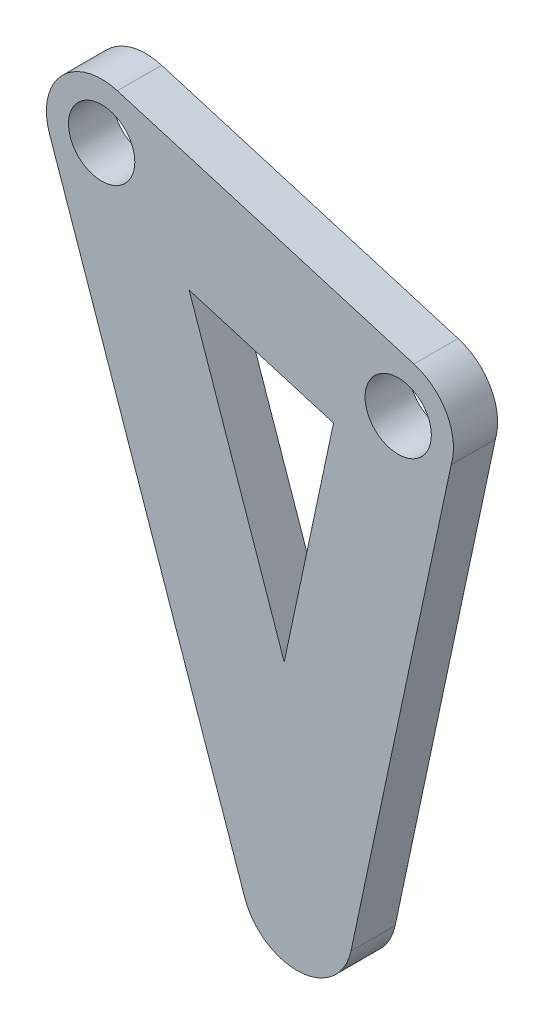
ISO-10303-21;
HEADER;
FILE_DESCRIPTION(('STEP AP214'),'2;1');
FILE_NAME('part.step','',(''),(''),'','','');
FILE_SCHEMA(('AUTOMOTIVE_DESIGN { 1 0 10303 214 1 1 1 1 }'));
ENDSEC;
DATA;
#1=APPLICATION_CONTEXT('core data for automotive mechanical design processes');
#2=APPLICATION_PROTOCOL_DEFINITION('international standard','automotive_design',2000,#1);
#3=PRODUCT_CONTEXT('',#1,'mechanical');
#4=PRODUCT('Part','Part','',(#3));
#5=PRODUCT_RELATED_PRODUCT_CATEGORY('part','',(#4));
#6=PRODUCT_DEFINITION_FORMATION('','',#4);
#7=PRODUCT_DEFINITION_CONTEXT('part definition',#1,'design');
#8=PRODUCT_DEFINITION('design','',#6,#7);
#9=PRODUCT_DEFINITION_SHAPE('','',#8);
#10=(LENGTH_UNIT() NAMED_UNIT(*) SI_UNIT(.MILLI.,.METRE.));
#11=(NAMED_UNIT(*) PLANE_ANGLE_UNIT() SI_UNIT($,.RADIAN.));
#12=(NAMED_UNIT(*) SI_UNIT($,.STERADIAN.) SOLID_ANGLE_UNIT());
#13=UNCERTAINTY_MEASURE_WITH_UNIT(LENGTH_MEASURE(1.E-05),#10,'distance_accuracy_value','');
#14=(GEOMETRIC_REPRESENTATION_CONTEXT(3) GLOBAL_UNCERTAINTY_ASSIGNED_CONTEXT((#13)) GLOBAL_UNIT_ASSIGNED_CONTEXT((#10,
#11,#12)) REPRESENTATION_CONTEXT('',''));
#15=CARTESIAN_POINT('',(0.,0.,0.));
#16=DIRECTION('',(0.,0.,1.));
#17=DIRECTION('',(1.,0.,0.));
#18=AXIS2_PLACEMENT_3D('',#15,#16,#17);
#19=CARTESIAN_POINT('',(-6.27205932046679,-21.0573996219625,-2.));
#20=DIRECTION('',(-0.285461637934703,-0.958390136253309,0.));
#21=DIRECTION('',(0.958390136253309,-0.285461637934703,0.));
#22=AXIS2_PLACEMENT_3D('',#19,#20,#21);
#23=PLANE('',#22);
#24=DIRECTION('',(0.958390136253309,-0.285461637934703,0.));
#25=VECTOR('',#24,1.);
#26=CARTESIAN_POINT('',(-6.27205932046679,-21.0573996219625,0.));
#27=LINE('',#26,#25);
#28=CARTESIAN_POINT('',(-30.620361937396,-13.8051272090489,0.));
#29=VERTEX_POINT('',#28);
#30=CARTESIAN_POINT('',(-24.0859127583845,-15.7514479140323,0.));
#31=VERTEX_POINT('',#30);
#32=EDGE_CURVE('E157',#29,#31,#27,.T.);
#33=ORIENTED_EDGE('',*,*,#32,.F.);
#34=DIRECTION('',(0.,0.,1.));
#35=VECTOR('',#34,1.);
#36=CARTESIAN_POINT('',(-30.620361937396,-13.8051272090489,-2.));
#37=LINE('',#36,#35);
#38=CARTESIAN_POINT('',(-30.620361937396,-13.8051272090489,-2.));
#39=VERTEX_POINT('',#38);
#40=EDGE_CURVE('E11',#39,#29,#37,.T.);
#41=ORIENTED_EDGE('',*,*,#40,.F.);
#42=DIRECTION('',(0.958390136253309,-0.285461637934703,0.));
#43=VECTOR('',#42,1.);
#44=CARTESIAN_POINT('',(-6.27205932046679,-21.0573996219625,-2.));
#45=LINE('',#44,#43);
#46=CARTESIAN_POINT('',(-24.0859127583845,-15.7514479140323,-2.));
#47=VERTEX_POINT('',#46);
#48=EDGE_CURVE('E127',#39,#47,#45,.T.);
#49=ORIENTED_EDGE('',*,*,#48,.T.);
#50=DIRECTION('',(0.,0.,1.));
#51=VECTOR('',#50,1.);
#52=CARTESIAN_POINT('',(-24.0859127583845,-15.7514479140323,-2.));
#53=LINE('',#52,#51);
#54=EDGE_CURVE('E115',#47,#31,#53,.T.);
#55=ORIENTED_EDGE('',*,*,#54,.T.);
#56=EDGE_LOOP('',(#33,#41,#49,#55));
#57=FACE_BOUND('',#56,.T.);
#58=ADVANCED_FACE('F39',(#57),#23,.T.);
#59=CARTESIAN_POINT('',(-31.6105521830669,-10.9454491931307,-2.));
#60=DIRECTION('',(-0.944955252141447,-0.327199589624275,0.));
#61=DIRECTION('',(0.327199589624275,-0.944955252141447,0.));
#62=AXIS2_PLACEMENT_3D('',#59,#60,#61);
#63=PLANE('',#62);
#64=DIRECTION('',(0.327199589624275,-0.944955252141447,0.));
#65=VECTOR('',#64,1.);
#66=CARTESIAN_POINT('',(-31.6105521830669,-10.9454491931307,0.));
#67=LINE('',#66,#65);
#68=CARTESIAN_POINT('',(-26.3179189103769,-26.230619979653,0.));
#69=VERTEX_POINT('',#68);
#70=EDGE_CURVE('E160',#29,#69,#67,.T.);
#71=ORIENTED_EDGE('',*,*,#70,.T.);
#72=DIRECTION('',(0.,0.,1.));
#73=VECTOR('',#72,1.);
#74=CARTESIAN_POINT('',(-26.3179189103769,-26.230619979653,-2.));
#75=LINE('',#74,#73);
#76=CARTESIAN_POINT('',(-26.3179189103769,-26.230619979653,-2.));
#77=VERTEX_POINT('',#76);
#78=EDGE_CURVE('E49',#77,#69,#75,.T.);
#79=ORIENTED_EDGE('',*,*,#78,.F.);
#80=DIRECTION('',(0.327199589624275,-0.944955252141447,0.));
#81=VECTOR('',#80,1.);
#82=CARTESIAN_POINT('',(-31.6105521830669,-10.9454491931307,-2.));
#83=LINE('',#82,#81);
#84=EDGE_CURVE('E128',#39,#77,#83,.T.);
#85=ORIENTED_EDGE('',*,*,#84,.F.);
#86=ORIENTED_EDGE('',*,*,#40,.T.);
#87=EDGE_LOOP('',(#71,#79,#85,#86));
#88=FACE_BOUND('',#87,.T.);
#89=ADVANCED_FACE('F217',(#88),#63,.F.);
#90=CARTESIAN_POINT('',(-14.9563728948536,3.17994453566595,-2.));
#91=DIRECTION('',(0.978136036901298,-0.207966086934921,0.));
#92=DIRECTION('',(0.207966086934921,0.978136036901298,0.));
#93=AXIS2_PLACEMENT_3D('',#90,#91,#92);
#94=PLANE('',#93);
#95=DIRECTION('',(0.207966086934921,0.978136036901298,0.));
#96=VECTOR('',#95,1.);
#97=CARTESIAN_POINT('',(-14.9563728948536,3.17994453566595,0.));
#98=LINE('',#97,#96);
#99=CARTESIAN_POINT('',(-23.2977836940613,-36.052579485695,0.));
#100=VERTEX_POINT('',#99);
#101=CARTESIAN_POINT('',(-18.7638863744568,-14.7281009551973,0.));
#102=VERTEX_POINT('',#101);
#103=EDGE_CURVE('E138',#100,#102,#98,.T.);
#104=ORIENTED_EDGE('',*,*,#103,.F.);
#105=DIRECTION('',(0.,0.,1.));
#106=VECTOR('',#105,1.);
#107=CARTESIAN_POINT('',(-23.2977836940613,-36.052579485695,-2.));
#108=LINE('',#107,#106);
#109=CARTESIAN_POINT('',(-23.2977836940613,-36.052579485695,-2.));
#110=VERTEX_POINT('',#109);
#111=EDGE_CURVE('E122',#110,#100,#108,.T.);
#112=ORIENTED_EDGE('',*,*,#111,.F.);
#113=DIRECTION('',(0.207966086934921,0.978136036901298,0.));
#114=VECTOR('',#113,1.);
#115=CARTESIAN_POINT('',(-14.9563728948536,3.17994453566595,-2.));
#116=LINE('',#115,#114);
#117=CARTESIAN_POINT('',(-18.7638863744568,-14.7281009551973,-2.));
#118=VERTEX_POINT('',#117);
#119=EDGE_CURVE('E161',#110,#118,#116,.T.);
#120=ORIENTED_EDGE('',*,*,#119,.T.);
#121=DIRECTION('',(0.,0.,1.));
#122=VECTOR('',#121,1.);
#123=CARTESIAN_POINT('',(-18.7638863744568,-14.7281009551973,-2.));
#124=LINE('',#123,#122);
#125=EDGE_CURVE('E43',#118,#102,#124,.T.);
#126=ORIENTED_EDGE('',*,*,#125,.T.);
#127=EDGE_LOOP('',(#104,#112,#120,#126));
#128=FACE_BOUND('',#127,.T.);
#129=ADVANCED_FACE('F41',(#128),#94,.T.);
#130=CARTESIAN_POINT('',(-25.742934702781,-35.5317757370937,-2.));
#131=DIRECTION('',(0.,0.,1.));
#132=DIRECTION('',(1.,0.,0.));
#133=AXIS2_PLACEMENT_3D('',#130,#131,#132);
#134=CYLINDRICAL_SURFACE('',#133,2.49999999999999);
#135=CARTESIAN_POINT('',(-25.742934702781,-35.5317757370937,0.));
#136=DIRECTION('',(0.,0.,1.));
#137=DIRECTION('',(1.,0.,0.));
#138=AXIS2_PLACEMENT_3D('',#135,#136,#137);
#139=CIRCLE('',#138,2.49999999999999);
#140=CARTESIAN_POINT('',(-28.1053228331346,-36.3497747111544,0.));
#141=VERTEX_POINT('',#140);
#142=EDGE_CURVE('E154',#141,#100,#139,.T.);
#143=ORIENTED_EDGE('',*,*,#142,.F.);
#144=DIRECTION('',(0.,0.,1.));
#145=VECTOR('',#144,1.);
#146=CARTESIAN_POINT('',(-28.1053228331346,-36.3497747111544,-2.));
#147=LINE('',#146,#145);
#148=CARTESIAN_POINT('',(-28.1053228331346,-36.3497747111544,-2.));
#149=VERTEX_POINT('',#148);
#150=EDGE_CURVE('E165',#149,#141,#147,.T.);
#151=ORIENTED_EDGE('',*,*,#150,.F.);
#152=CARTESIAN_POINT('',(-25.742934702781,-35.5317757370937,-2.));
#153=DIRECTION('',(0.,0.,1.));
#154=DIRECTION('',(1.,0.,0.));
#155=AXIS2_PLACEMENT_3D('',#152,#153,#154);
#156=CIRCLE('',#155,2.49999999999999);
#157=EDGE_CURVE('E130',#149,#110,#156,.T.);
#158=ORIENTED_EDGE('',*,*,#157,.T.);
#159=ORIENTED_EDGE('',*,*,#111,.T.);
#160=EDGE_LOOP('',(#143,#151,#158,#159));
#161=FACE_BOUND('',#160,.T.);
#162=ADVANCED_FACE('F184',(#161),#134,.T.);
#163=CARTESIAN_POINT('',(-36.3353284437742,-12.5814471412521,-2.));
#164=DIRECTION('',(-0.944955252141447,-0.327199589624276,0.));
#165=DIRECTION('',(0.327199589624276,-0.944955252141447,0.));
#166=AXIS2_PLACEMENT_3D('',#163,#164,#165);
#167=PLANE('',#166);
#168=DIRECTION('',(0.327199589624276,-0.944955252141447,0.));
#169=VECTOR('',#168,1.);
#170=CARTESIAN_POINT('',(-36.3353284437742,-12.5814471412521,0.));
#171=LINE('',#170,#169);
#172=CARTESIAN_POINT('',(-36.9397117529901,-10.8359829033354,0.));
#173=VERTEX_POINT('',#172);
#174=EDGE_CURVE('E151',#173,#141,#171,.T.);
#175=ORIENTED_EDGE('',*,*,#174,.F.);
#176=DIRECTION('',(0.,0.,1.));
#177=VECTOR('',#176,1.);
#178=CARTESIAN_POINT('',(-36.9397117529901,-10.8359829033354,-2.));
#179=LINE('',#178,#177);
#180=CARTESIAN_POINT('',(-36.9397117529901,-10.8359829033354,-2.));
#181=VERTEX_POINT('',#180);
#182=EDGE_CURVE('E167',#181,#173,#179,.T.);
#183=ORIENTED_EDGE('',*,*,#182,.F.);
#184=DIRECTION('',(0.327199589624276,-0.944955252141447,0.));
#185=VECTOR('',#184,1.);
#186=CARTESIAN_POINT('',(-36.3353284437742,-12.5814471412521,-2.));
#187=LINE('',#186,#185);
#188=EDGE_CURVE('E133',#181,#149,#187,.T.);
#189=ORIENTED_EDGE('',*,*,#188,.T.);
#190=ORIENTED_EDGE('',*,*,#150,.T.);
#191=EDGE_LOOP('',(#175,#183,#189,#190));
#192=FACE_BOUND('',#191,.T.);
#193=ADVANCED_FACE('F201',(#192),#167,.T.);
#194=CARTESIAN_POINT('',(-34.5773236226365,-10.0179839292747,-2.));
#195=DIRECTION('',(0.,0.,1.));
#196=DIRECTION('',(1.,0.,0.));
#197=AXIS2_PLACEMENT_3D('',#194,#195,#196);
#198=CYLINDRICAL_SURFACE('',#197,2.50000000000001);
#199=CARTESIAN_POINT('',(-34.5773236226365,-10.0179839292747,0.));
#200=DIRECTION('',(0.,0.,1.));
#201=DIRECTION('',(1.,0.,0.));
#202=AXIS2_PLACEMENT_3D('',#199,#200,#201);
#203=CIRCLE('',#202,2.50000000000001);
#204=CARTESIAN_POINT('',(-33.8636695277997,-7.62200858864139,0.));
#205=VERTEX_POINT('',#204);
#206=EDGE_CURVE('E148',#205,#173,#203,.T.);
#207=ORIENTED_EDGE('',*,*,#206,.F.);
#208=DIRECTION('',(0.,0.,1.));
#209=VECTOR('',#208,1.);
#210=CARTESIAN_POINT('',(-33.8636695277997,-7.62200858864139,-2.));
#211=LINE('',#210,#209);
#212=CARTESIAN_POINT('',(-33.8636695277997,-7.62200858864139,-2.));
#213=VERTEX_POINT('',#212);
#214=EDGE_CURVE('E169',#213,#205,#211,.T.);
#215=ORIENTED_EDGE('',*,*,#214,.F.);
#216=CARTESIAN_POINT('',(-34.5773236226365,-10.0179839292747,-2.));
#217=DIRECTION('',(0.,0.,1.));
#218=DIRECTION('',(1.,0.,0.));
#219=AXIS2_PLACEMENT_3D('',#216,#217,#218);
#220=CIRCLE('',#219,2.50000000000001);
#221=EDGE_CURVE('E198',#213,#181,#220,.T.);
#222=ORIENTED_EDGE('',*,*,#221,.T.);
#223=ORIENTED_EDGE('',*,*,#182,.T.);
#224=EDGE_LOOP('',(#207,#215,#222,#223));
#225=FACE_BOUND('',#224,.T.);
#226=ADVANCED_FACE('F205',(#225),#198,.T.);
#227=CARTESIAN_POINT('',(-4.84475113079326,-16.2654489406959,-2.));
#228=DIRECTION('',(-0.285461637934702,-0.958390136253309,0.));
#229=DIRECTION('',(0.958390136253309,-0.285461637934702,0.));
#230=AXIS2_PLACEMENT_3D('',#227,#228,#229);
#231=PLANE('',#230);
#232=DIRECTION('',(0.958390136253309,-0.285461637934702,0.));
#233=VECTOR('',#232,1.);
#234=CARTESIAN_POINT('',(-4.84475113079326,-16.2654489406959,0.));
#235=LINE('',#234,#233);
#236=CARTESIAN_POINT('',(-20.4462076202534,-11.6184715197272,0.));
#237=VERTEX_POINT('',#236);
#238=EDGE_CURVE('E145',#205,#237,#235,.T.);
#239=ORIENTED_EDGE('',*,*,#238,.T.);
#240=DIRECTION('',(0.,0.,1.));
#241=VECTOR('',#240,1.);
#242=CARTESIAN_POINT('',(-20.4462076202534,-11.6184715197272,-2.));
#243=LINE('',#242,#241);
#244=CARTESIAN_POINT('',(-20.4462076202534,-11.6184715197272,-2.));
#245=VERTEX_POINT('',#244);
#246=EDGE_CURVE('E170',#245,#237,#243,.T.);
#247=ORIENTED_EDGE('',*,*,#246,.F.);
#248=DIRECTION('',(0.958390136253309,-0.285461637934702,0.));
#249=VECTOR('',#248,1.);
#250=CARTESIAN_POINT('',(-4.84475113079326,-16.2654489406959,-2.));
#251=LINE('',#250,#249);
#252=EDGE_CURVE('E191',#213,#245,#251,.T.);
#253=ORIENTED_EDGE('',*,*,#252,.F.);
#254=ORIENTED_EDGE('',*,*,#214,.T.);
#255=EDGE_LOOP('',(#239,#247,#253,#254));
#256=FACE_BOUND('',#255,.T.);
#257=ADVANCED_FACE('F208',(#256),#231,.F.);
#258=CARTESIAN_POINT('',(-21.1598617150901,-14.0144468603605,-2.));
#259=DIRECTION('',(0.,0.,1.));
#260=DIRECTION('',(1.,0.,0.));
#261=AXIS2_PLACEMENT_3D('',#258,#259,#260);
#262=CYLINDRICAL_SURFACE('',#261,2.5);
#263=CARTESIAN_POINT('',(-21.1598617150901,-14.0144468603605,0.));
#264=DIRECTION('',(0.,0.,1.));
#265=DIRECTION('',(1.,0.,0.));
#266=AXIS2_PLACEMENT_3D('',#263,#264,#265);
#267=CIRCLE('',#266,2.5);
#268=EDGE_CURVE('E141',#102,#237,#267,.T.);
#269=ORIENTED_EDGE('',*,*,#268,.F.);
#270=ORIENTED_EDGE('',*,*,#125,.F.);
#271=CARTESIAN_POINT('',(-21.1598617150901,-14.0144468603605,-2.));
#272=DIRECTION('',(0.,0.,1.));
#273=DIRECTION('',(1.,0.,0.));
#274=AXIS2_PLACEMENT_3D('',#271,#272,#273);
#275=CIRCLE('',#274,2.5);
#276=EDGE_CURVE('E189',#118,#245,#275,.T.);
#277=ORIENTED_EDGE('',*,*,#276,.T.);
#278=ORIENTED_EDGE('',*,*,#246,.T.);
#279=EDGE_LOOP('',(#269,#270,#277,#278));
#280=FACE_BOUND('',#279,.T.);
#281=ADVANCED_FACE('F176',(#280),#262,.T.);
#282=CARTESIAN_POINT('',(-19.8312625802662,4.22395011779093,-2.));
#283=DIRECTION('',(-0.978060403487874,0.208321499440496,0.));
#284=DIRECTION('',(-0.208321499440496,-0.978060403487874,0.));
#285=AXIS2_PLACEMENT_3D('',#282,#283,#284);
#286=PLANE('',#285);
#287=DIRECTION('',(-0.208321499440496,-0.978060403487874,0.));
#288=VECTOR('',#287,1.);
#289=CARTESIAN_POINT('',(-19.8312625802662,4.22395011779093,0.));
#290=LINE('',#289,#288);
#291=EDGE_CURVE('E120',#31,#69,#290,.T.);
#292=ORIENTED_EDGE('',*,*,#291,.F.);
#293=ORIENTED_EDGE('',*,*,#54,.F.);
#294=DIRECTION('',(-0.208321499440496,-0.978060403487874,0.));
#295=VECTOR('',#294,1.);
#296=CARTESIAN_POINT('',(-19.8312625802662,4.22395011779093,-2.));
#297=LINE('',#296,#295);
#298=EDGE_CURVE('E118',#47,#77,#297,.T.);
#299=ORIENTED_EDGE('',*,*,#298,.T.);
#300=ORIENTED_EDGE('',*,*,#78,.T.);
#301=EDGE_LOOP('',(#292,#293,#299,#300));
#302=FACE_BOUND('',#301,.T.);
#303=ADVANCED_FACE('F117',(#302),#286,.T.);
#304=CARTESIAN_POINT('',(0.,0.,-2.));
#305=DIRECTION('',(0.,0.,1.));
#306=DIRECTION('',(1.,0.,0.));
#307=AXIS2_PLACEMENT_3D('',#304,#305,#306);
#308=PLANE('',#307);
#309=CARTESIAN_POINT('',(-34.5773236226365,-10.0179839292747,-2.));
#310=DIRECTION('',(0.,0.,1.));
#311=DIRECTION('',(1.,0.,0.));
#312=AXIS2_PLACEMENT_3D('',#309,#310,#311);
#313=CIRCLE('',#312,1.5);
#314=CARTESIAN_POINT('',(-33.0773236226365,-10.0179839292747,-2.));
#315=VERTEX_POINT('',#314);
#316=EDGE_CURVE('E142',#315,#315,#313,.T.);
#317=ORIENTED_EDGE('',*,*,#316,.T.);
#318=EDGE_LOOP('',(#317));
#319=FACE_BOUND('',#318,.T.);
#320=CARTESIAN_POINT('',(-21.1598617150901,-14.0144468603605,-2.));
#321=DIRECTION('',(0.,0.,1.));
#322=DIRECTION('',(1.,0.,0.));
#323=AXIS2_PLACEMENT_3D('',#320,#321,#322);
#324=CIRCLE('',#323,1.5);
#325=CARTESIAN_POINT('',(-19.6598617150901,-14.0144468603605,-2.));
#326=VERTEX_POINT('',#325);
#327=EDGE_CURVE('E194',#326,#326,#324,.T.);
#328=ORIENTED_EDGE('',*,*,#327,.T.);
#329=EDGE_LOOP('',(#328));
#330=FACE_BOUND('',#329,.T.);
#331=ORIENTED_EDGE('',*,*,#119,.F.);
#332=ORIENTED_EDGE('',*,*,#157,.F.);
#333=ORIENTED_EDGE('',*,*,#188,.F.);
#334=ORIENTED_EDGE('',*,*,#221,.F.);
#335=ORIENTED_EDGE('',*,*,#252,.T.);
#336=ORIENTED_EDGE('',*,*,#276,.F.);
#337=EDGE_LOOP('',(#331,#332,#333,#334,#335,#336));
#338=FACE_BOUND('',#337,.T.);
#339=ORIENTED_EDGE('',*,*,#48,.F.);
#340=ORIENTED_EDGE('',*,*,#84,.T.);
#341=ORIENTED_EDGE('',*,*,#298,.F.);
#342=EDGE_LOOP('',(#339,#340,#341));
#343=FACE_BOUND('',#342,.T.);
#344=ADVANCED_FACE('F126',(#319,#330,#338,#343),#308,.F.);
#345=CARTESIAN_POINT('',(0.,0.,0.));
#346=DIRECTION('',(0.,0.,1.));
#347=DIRECTION('',(1.,0.,0.));
#348=AXIS2_PLACEMENT_3D('',#345,#346,#347);
#349=PLANE('',#348);
#350=CARTESIAN_POINT('',(-34.5773236226365,-10.0179839292747,0.));
#351=DIRECTION('',(0.,0.,1.));
#352=DIRECTION('',(1.,0.,0.));
#353=AXIS2_PLACEMENT_3D('',#350,#351,#352);
#354=CIRCLE('',#353,1.5);
#355=CARTESIAN_POINT('',(-33.0773236226365,-10.0179839292747,0.));
#356=VERTEX_POINT('',#355);
#357=EDGE_CURVE('E412',#356,#356,#354,.T.);
#358=ORIENTED_EDGE('',*,*,#357,.F.);
#359=EDGE_LOOP('',(#358));
#360=FACE_BOUND('',#359,.T.);
#361=CARTESIAN_POINT('',(-21.1598617150901,-14.0144468603605,0.));
#362=DIRECTION('',(0.,0.,1.));
#363=DIRECTION('',(1.,0.,0.));
#364=AXIS2_PLACEMENT_3D('',#361,#362,#363);
#365=CIRCLE('',#364,1.5);
#366=CARTESIAN_POINT('',(-19.6598617150901,-14.0144468603605,0.));
#367=VERTEX_POINT('',#366);
#368=EDGE_CURVE('E413',#367,#367,#365,.T.);
#369=ORIENTED_EDGE('',*,*,#368,.F.);
#370=EDGE_LOOP('',(#369));
#371=FACE_BOUND('',#370,.T.);
#372=ORIENTED_EDGE('',*,*,#103,.T.);
#373=ORIENTED_EDGE('',*,*,#268,.T.);
#374=ORIENTED_EDGE('',*,*,#238,.F.);
#375=ORIENTED_EDGE('',*,*,#206,.T.);
#376=ORIENTED_EDGE('',*,*,#174,.T.);
#377=ORIENTED_EDGE('',*,*,#142,.T.);
#378=EDGE_LOOP('',(#372,#373,#374,#375,#376,#377));
#379=FACE_BOUND('',#378,.T.);
#380=ORIENTED_EDGE('',*,*,#32,.T.);
#381=ORIENTED_EDGE('',*,*,#291,.T.);
#382=ORIENTED_EDGE('',*,*,#70,.F.);
#383=EDGE_LOOP('',(#380,#381,#382));
#384=FACE_BOUND('',#383,.T.);
#385=ADVANCED_FACE('F179',(#360,#371,#379,#384),#349,.T.);
#386=CARTESIAN_POINT('',(-21.1598617150901,-14.0144468603605,-2.));
#387=DIRECTION('',(0.,0.,1.));
#388=DIRECTION('',(1.,0.,0.));
#389=AXIS2_PLACEMENT_3D('',#386,#387,#388);
#390=CYLINDRICAL_SURFACE('',#389,1.5);
#391=ORIENTED_EDGE('',*,*,#327,.F.);
#392=EDGE_LOOP('',(#391));
#393=FACE_BOUND('',#392,.T.);
#394=ORIENTED_EDGE('',*,*,#368,.T.);
#395=EDGE_LOOP('',(#394));
#396=FACE_BOUND('',#395,.T.);
#397=ADVANCED_FACE('F280',(#393,#396),#390,.F.);
#398=CARTESIAN_POINT('',(-34.5773236226365,-10.0179839292747,-2.));
#399=DIRECTION('',(0.,0.,1.));
#400=DIRECTION('',(1.,0.,0.));
#401=AXIS2_PLACEMENT_3D('',#398,#399,#400);
#402=CYLINDRICAL_SURFACE('',#401,1.5);
#403=ORIENTED_EDGE('',*,*,#316,.F.);
#404=EDGE_LOOP('',(#403));
#405=FACE_BOUND('',#404,.T.);
#406=ORIENTED_EDGE('',*,*,#357,.T.);
#407=EDGE_LOOP('',(#406));
#408=FACE_BOUND('',#407,.T.);
#409=ADVANCED_FACE('F291',(#405,#408),#402,.F.);
#410=CLOSED_SHELL('',(#58,#89,#129,#162,#193,#226,#257,#281,#303,#344,#385,#397,#409));
#411=MANIFOLD_SOLID_BREP('B2',#410);
#412=ADVANCED_BREP_SHAPE_REPRESENTATION('',(#18,#411),#14);
#413=SHAPE_DEFINITION_REPRESENTATION(#9,#412);
ENDSEC;
END-ISO-10303-21;
